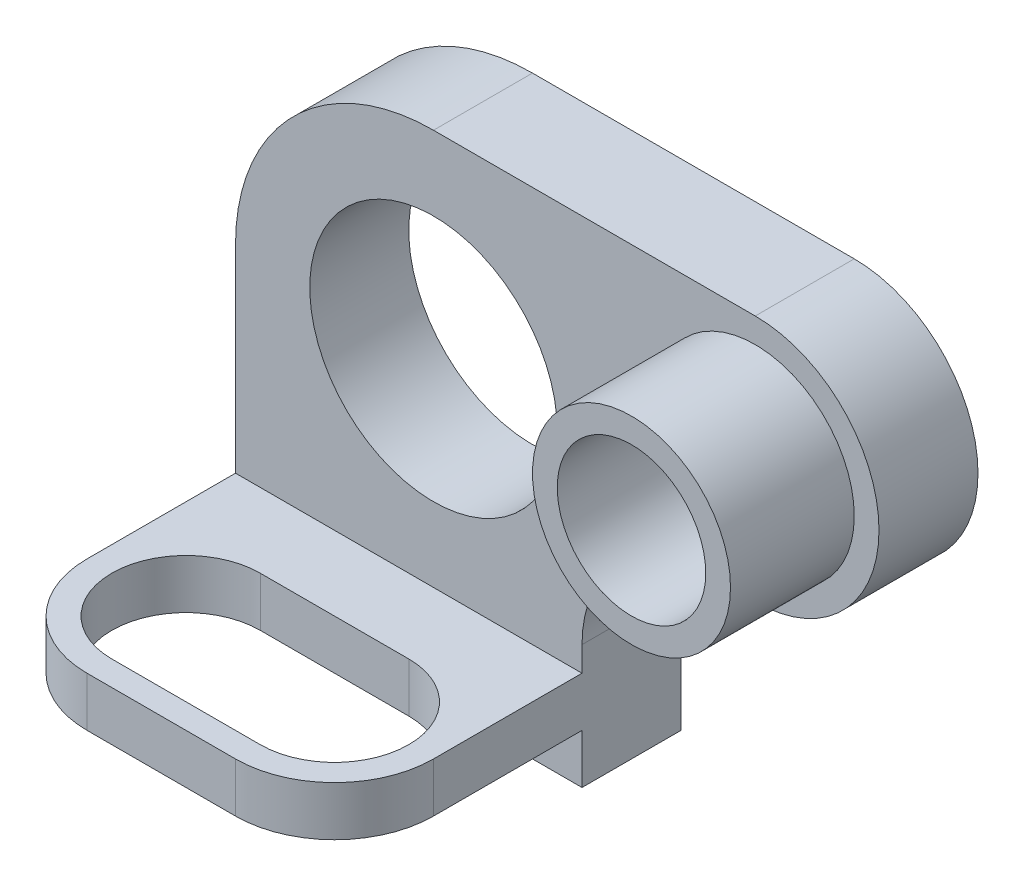
ISO-10303-21;
HEADER;
FILE_DESCRIPTION(('STEP AP214'),'2;1');
FILE_NAME('part.step','',(''),(''),'','','');
FILE_SCHEMA(('AUTOMOTIVE_DESIGN { 1 0 10303 214 1 1 1 1 }'));
ENDSEC;
DATA;
#1=APPLICATION_CONTEXT('core data for automotive mechanical design processes');
#2=APPLICATION_PROTOCOL_DEFINITION('international standard','automotive_design',2000,#1);
#3=PRODUCT_CONTEXT('',#1,'mechanical');
#4=PRODUCT('Part','Part','',(#3));
#5=PRODUCT_RELATED_PRODUCT_CATEGORY('part','',(#4));
#6=PRODUCT_DEFINITION_FORMATION('','',#4);
#7=PRODUCT_DEFINITION_CONTEXT('part definition',#1,'design');
#8=PRODUCT_DEFINITION('design','',#6,#7);
#9=PRODUCT_DEFINITION_SHAPE('','',#8);
#10=(LENGTH_UNIT() NAMED_UNIT(*) SI_UNIT(.MILLI.,.METRE.));
#11=(NAMED_UNIT(*) PLANE_ANGLE_UNIT() SI_UNIT($,.RADIAN.));
#12=(NAMED_UNIT(*) SI_UNIT($,.STERADIAN.) SOLID_ANGLE_UNIT());
#13=UNCERTAINTY_MEASURE_WITH_UNIT(LENGTH_MEASURE(1.E-05),#10,'distance_accuracy_value','');
#14=(GEOMETRIC_REPRESENTATION_CONTEXT(3) GLOBAL_UNCERTAINTY_ASSIGNED_CONTEXT((#13)) GLOBAL_UNIT_ASSIGNED_CONTEXT((#10,
#11,#12)) REPRESENTATION_CONTEXT('',''));
#15=CARTESIAN_POINT('',(0.,0.,0.));
#16=DIRECTION('',(0.,0.,1.));
#17=DIRECTION('',(1.,0.,0.));
#18=AXIS2_PLACEMENT_3D('',#15,#16,#17);
#19=CARTESIAN_POINT('',(0.,9.99999999999999,-90.7106781186548));
#20=DIRECTION('',(0.,1.,0.));
#21=DIRECTION('',(-1.,0.,0.));
#22=AXIS2_PLACEMENT_3D('',#19,#20,#21);
#23=PLANE('',#22);
#24=DIRECTION('',(-1.,0.,0.));
#25=VECTOR('',#24,1.);
#26=CARTESIAN_POINT('',(0.,9.99999999999999,15.));
#27=LINE('',#26,#25);
#28=CARTESIAN_POINT('',(50.,10.,15.));
#29=VERTEX_POINT('',#28);
#30=CARTESIAN_POINT('',(20.,9.99999999999999,15.));
#31=VERTEX_POINT('',#30);
#32=EDGE_CURVE('E195',#29,#31,#27,.T.);
#33=ORIENTED_EDGE('',*,*,#32,.T.);
#34=CARTESIAN_POINT('',(20.,9.99999999999999,30.));
#35=DIRECTION('',(0.,1.,0.));
#36=DIRECTION('',(-1.,0.,0.));
#37=AXIS2_PLACEMENT_3D('',#34,#35,#36);
#38=CIRCLE('',#37,15.);
#39=CARTESIAN_POINT('',(20.,9.99999999999999,45.));
#40=VERTEX_POINT('',#39);
#41=EDGE_CURVE('E198',#31,#40,#38,.T.);
#42=ORIENTED_EDGE('',*,*,#41,.T.);
#43=DIRECTION('',(1.,0.,0.));
#44=VECTOR('',#43,1.);
#45=CARTESIAN_POINT('',(0.,9.99999999999999,45.));
#46=LINE('',#45,#44);
#47=CARTESIAN_POINT('',(50.,10.,45.));
#48=VERTEX_POINT('',#47);
#49=EDGE_CURVE('E190',#40,#48,#46,.T.);
#50=ORIENTED_EDGE('',*,*,#49,.T.);
#51=CARTESIAN_POINT('',(50.,10.,30.));
#52=DIRECTION('',(0.,1.,0.));
#53=DIRECTION('',(-1.,0.,0.));
#54=AXIS2_PLACEMENT_3D('',#51,#52,#53);
#55=CIRCLE('',#54,15.);
#56=EDGE_CURVE('E170',#48,#29,#55,.T.);
#57=ORIENTED_EDGE('',*,*,#56,.T.);
#58=EDGE_LOOP('',(#33,#42,#50,#57));
#59=FACE_BOUND('',#58,.T.);
#60=DIRECTION('',(-1.,0.,0.));
#61=VECTOR('',#60,1.);
#62=CARTESIAN_POINT('',(0.,9.99999999999999,50.));
#63=LINE('',#62,#61);
#64=CARTESIAN_POINT('',(50.,10.,50.));
#65=VERTEX_POINT('',#64);
#66=CARTESIAN_POINT('',(20.,9.99999999999999,50.));
#67=VERTEX_POINT('',#66);
#68=EDGE_CURVE('E233',#65,#67,#63,.T.);
#69=ORIENTED_EDGE('',*,*,#68,.T.);
#70=CARTESIAN_POINT('',(20.,9.99999999999999,30.));
#71=DIRECTION('',(0.,1.,0.));
#72=DIRECTION('',(-1.,0.,0.));
#73=AXIS2_PLACEMENT_3D('',#70,#71,#72);
#74=CIRCLE('',#73,20.);
#75=CARTESIAN_POINT('',(0.,9.99999999999999,30.));
#76=VERTEX_POINT('',#75);
#77=EDGE_CURVE('E47',#67,#76,#74,.F.);
#78=ORIENTED_EDGE('',*,*,#77,.T.);
#79=DIRECTION('',(0.,0.,1.));
#80=VECTOR('',#79,1.);
#81=CARTESIAN_POINT('',(0.,9.99999999999999,-90.7106781186548));
#82=LINE('',#81,#80);
#83=CARTESIAN_POINT('',(0.,9.99999999999999,0.));
#84=VERTEX_POINT('',#83);
#85=EDGE_CURVE('E241',#84,#76,#82,.T.);
#86=ORIENTED_EDGE('',*,*,#85,.F.);
#87=DIRECTION('',(-1.,0.,0.));
#88=VECTOR('',#87,1.);
#89=CARTESIAN_POINT('',(0.,9.99999999999999,0.));
#90=LINE('',#89,#88);
#91=CARTESIAN_POINT('',(70.,9.99999999999999,0.));
#92=VERTEX_POINT('',#91);
#93=EDGE_CURVE('E218',#92,#84,#90,.T.);
#94=ORIENTED_EDGE('',*,*,#93,.F.);
#95=DIRECTION('',(0.,0.,1.));
#96=VECTOR('',#95,1.);
#97=CARTESIAN_POINT('',(70.,9.99999999999999,-90.7106781186548));
#98=LINE('',#97,#96);
#99=CARTESIAN_POINT('',(70.,9.99999999999999,30.));
#100=VERTEX_POINT('',#99);
#101=EDGE_CURVE('E237',#92,#100,#98,.T.);
#102=ORIENTED_EDGE('',*,*,#101,.T.);
#103=CARTESIAN_POINT('',(50.,10.,30.));
#104=DIRECTION('',(0.,1.,0.));
#105=DIRECTION('',(-1.,0.,0.));
#106=AXIS2_PLACEMENT_3D('',#103,#104,#105);
#107=CIRCLE('',#106,20.);
#108=EDGE_CURVE('E319',#100,#65,#107,.F.);
#109=ORIENTED_EDGE('',*,*,#108,.T.);
#110=EDGE_LOOP('',(#69,#78,#86,#94,#102,#109));
#111=FACE_BOUND('',#110,.T.);
#112=ADVANCED_FACE('F39',(#59,#111),#23,.F.);
#113=CARTESIAN_POINT('',(40.,60.,-20.));
#114=DIRECTION('',(0.,0.,1.));
#115=DIRECTION('',(1.,0.,0.));
#116=AXIS2_PLACEMENT_3D('',#113,#114,#115);
#117=CYLINDRICAL_SURFACE('',#116,40.);
#118=CARTESIAN_POINT('',(40.,60.,0.));
#119=DIRECTION('',(0.,0.,1.));
#120=DIRECTION('',(1.,0.,0.));
#121=AXIS2_PLACEMENT_3D('',#118,#119,#120);
#122=CIRCLE('',#121,40.);
#123=CARTESIAN_POINT('',(0.,59.9999999999997,0.));
#124=VERTEX_POINT('',#123);
#125=CARTESIAN_POINT('',(40.0000000000003,100.,0.));
#126=VERTEX_POINT('',#125);
#127=EDGE_CURVE('E271',#124,#126,#122,.F.);
#128=ORIENTED_EDGE('',*,*,#127,.T.);
#129=DIRECTION('',(0.,0.,1.));
#130=VECTOR('',#129,1.);
#131=CARTESIAN_POINT('',(40.0000000000003,100.,-20.));
#132=LINE('',#131,#130);
#133=CARTESIAN_POINT('',(40.0000000000003,100.,-20.));
#134=VERTEX_POINT('',#133);
#135=EDGE_CURVE('E291',#134,#126,#132,.T.);
#136=ORIENTED_EDGE('',*,*,#135,.F.);
#137=CARTESIAN_POINT('',(40.,60.,-20.));
#138=DIRECTION('',(0.,0.,1.));
#139=DIRECTION('',(1.,0.,0.));
#140=AXIS2_PLACEMENT_3D('',#137,#138,#139);
#141=CIRCLE('',#140,40.);
#142=CARTESIAN_POINT('',(0.,59.9999999999997,-20.));
#143=VERTEX_POINT('',#142);
#144=EDGE_CURVE('E249',#143,#134,#141,.F.);
#145=ORIENTED_EDGE('',*,*,#144,.F.);
#146=DIRECTION('',(0.,0.,1.));
#147=VECTOR('',#146,1.);
#148=CARTESIAN_POINT('',(0.,59.9999999999997,-20.));
#149=LINE('',#148,#147);
#150=EDGE_CURVE('E268',#143,#124,#149,.T.);
#151=ORIENTED_EDGE('',*,*,#150,.T.);
#152=EDGE_LOOP('',(#128,#136,#145,#151));
#153=FACE_BOUND('',#152,.T.);
#154=ADVANCED_FACE('F354',(#153),#117,.T.);
#155=CARTESIAN_POINT('',(0.,100.,-20.));
#156=DIRECTION('',(0.,-1.,0.));
#157=DIRECTION('',(0.,0.,-1.));
#158=AXIS2_PLACEMENT_3D('',#155,#156,#157);
#159=PLANE('',#158);
#160=DIRECTION('',(1.,0.,0.));
#161=VECTOR('',#160,1.);
#162=CARTESIAN_POINT('',(0.,100.,0.));
#163=LINE('',#162,#161);
#164=CARTESIAN_POINT('',(105.,100.,0.));
#165=VERTEX_POINT('',#164);
#166=EDGE_CURVE('E287',#126,#165,#163,.T.);
#167=ORIENTED_EDGE('',*,*,#166,.T.);
#168=DIRECTION('',(0.,0.,1.));
#169=VECTOR('',#168,1.);
#170=CARTESIAN_POINT('',(105.,100.,-20.));
#171=LINE('',#170,#169);
#172=CARTESIAN_POINT('',(105.,100.,-20.));
#173=VERTEX_POINT('',#172);
#174=EDGE_CURVE('E295',#173,#165,#171,.T.);
#175=ORIENTED_EDGE('',*,*,#174,.F.);
#176=DIRECTION('',(1.,0.,0.));
#177=VECTOR('',#176,1.);
#178=CARTESIAN_POINT('',(0.,100.,-20.));
#179=LINE('',#178,#177);
#180=EDGE_CURVE('E263',#134,#173,#179,.T.);
#181=ORIENTED_EDGE('',*,*,#180,.F.);
#182=ORIENTED_EDGE('',*,*,#135,.T.);
#183=EDGE_LOOP('',(#167,#175,#181,#182));
#184=FACE_BOUND('',#183,.T.);
#185=ADVANCED_FACE('F360',(#184),#159,.F.);
#186=CARTESIAN_POINT('',(105.,75.,-20.));
#187=DIRECTION('',(0.,0.,1.));
#188=DIRECTION('',(1.,0.,0.));
#189=AXIS2_PLACEMENT_3D('',#186,#187,#188);
#190=CYLINDRICAL_SURFACE('',#189,25.);
#191=CARTESIAN_POINT('',(105.,75.,0.));
#192=DIRECTION('',(0.,0.,1.));
#193=DIRECTION('',(1.,0.,0.));
#194=AXIS2_PLACEMENT_3D('',#191,#192,#193);
#195=CIRCLE('',#194,25.);
#196=CARTESIAN_POINT('',(105.,50.,0.));
#197=VERTEX_POINT('',#196);
#198=EDGE_CURVE('E285',#165,#197,#195,.F.);
#199=ORIENTED_EDGE('',*,*,#198,.T.);
#200=DIRECTION('',(0.,0.,1.));
#201=VECTOR('',#200,1.);
#202=CARTESIAN_POINT('',(105.,50.,-20.));
#203=LINE('',#202,#201);
#204=CARTESIAN_POINT('',(105.,50.,-20.));
#205=VERTEX_POINT('',#204);
#206=EDGE_CURVE('E298',#205,#197,#203,.T.);
#207=ORIENTED_EDGE('',*,*,#206,.F.);
#208=CARTESIAN_POINT('',(105.,75.,-20.));
#209=DIRECTION('',(0.,0.,1.));
#210=DIRECTION('',(1.,0.,0.));
#211=AXIS2_PLACEMENT_3D('',#208,#209,#210);
#212=CIRCLE('',#211,25.);
#213=EDGE_CURVE('E261',#173,#205,#212,.F.);
#214=ORIENTED_EDGE('',*,*,#213,.F.);
#215=ORIENTED_EDGE('',*,*,#174,.T.);
#216=EDGE_LOOP('',(#199,#207,#214,#215));
#217=FACE_BOUND('',#216,.T.);
#218=ADVANCED_FACE('F403',(#217),#190,.T.);
#219=CARTESIAN_POINT('',(0.,50.0000000000001,-20.));
#220=DIRECTION('',(0.,1.,0.));
#221=DIRECTION('',(-1.,0.,0.));
#222=AXIS2_PLACEMENT_3D('',#219,#220,#221);
#223=PLANE('',#222);
#224=DIRECTION('',(-1.,0.,0.));
#225=VECTOR('',#224,1.);
#226=CARTESIAN_POINT('',(0.,50.0000000000001,0.));
#227=LINE('',#226,#225);
#228=CARTESIAN_POINT('',(95.0000000000002,50.,0.));
#229=VERTEX_POINT('',#228);
#230=EDGE_CURVE('E283',#197,#229,#227,.T.);
#231=ORIENTED_EDGE('',*,*,#230,.T.);
#232=DIRECTION('',(0.,0.,1.));
#233=VECTOR('',#232,1.);
#234=CARTESIAN_POINT('',(95.0000000000002,50.,-20.));
#235=LINE('',#234,#233);
#236=CARTESIAN_POINT('',(95.0000000000002,50.,-20.));
#237=VERTEX_POINT('',#236);
#238=EDGE_CURVE('E301',#237,#229,#235,.T.);
#239=ORIENTED_EDGE('',*,*,#238,.F.);
#240=DIRECTION('',(-1.,0.,0.));
#241=VECTOR('',#240,1.);
#242=CARTESIAN_POINT('',(0.,50.0000000000001,-20.));
#243=LINE('',#242,#241);
#244=EDGE_CURVE('E259',#205,#237,#243,.T.);
#245=ORIENTED_EDGE('',*,*,#244,.F.);
#246=ORIENTED_EDGE('',*,*,#206,.T.);
#247=EDGE_LOOP('',(#231,#239,#245,#246));
#248=FACE_BOUND('',#247,.T.);
#249=ADVANCED_FACE('F406',(#248),#223,.F.);
#250=CARTESIAN_POINT('',(95.,25.,-20.));
#251=DIRECTION('',(0.,0.,1.));
#252=DIRECTION('',(1.,0.,0.));
#253=AXIS2_PLACEMENT_3D('',#250,#251,#252);
#254=CYLINDRICAL_SURFACE('',#253,25.);
#255=CARTESIAN_POINT('',(95.,25.,0.));
#256=DIRECTION('',(0.,0.,1.));
#257=DIRECTION('',(1.,0.,0.));
#258=AXIS2_PLACEMENT_3D('',#255,#256,#257);
#259=CIRCLE('',#258,25.);
#260=CARTESIAN_POINT('',(70.,24.9999999999998,0.));
#261=VERTEX_POINT('',#260);
#262=EDGE_CURVE('E281',#229,#261,#259,.T.);
#263=ORIENTED_EDGE('',*,*,#262,.T.);
#264=DIRECTION('',(0.,0.,1.));
#265=VECTOR('',#264,1.);
#266=CARTESIAN_POINT('',(70.,24.9999999999998,-20.));
#267=LINE('',#266,#265);
#268=CARTESIAN_POINT('',(70.,24.9999999999998,-20.));
#269=VERTEX_POINT('',#268);
#270=EDGE_CURVE('E304',#269,#261,#267,.T.);
#271=ORIENTED_EDGE('',*,*,#270,.F.);
#272=CARTESIAN_POINT('',(95.,25.,-20.));
#273=DIRECTION('',(0.,0.,1.));
#274=DIRECTION('',(1.,0.,0.));
#275=AXIS2_PLACEMENT_3D('',#272,#273,#274);
#276=CIRCLE('',#275,25.);
#277=EDGE_CURVE('E257',#237,#269,#276,.T.);
#278=ORIENTED_EDGE('',*,*,#277,.F.);
#279=ORIENTED_EDGE('',*,*,#238,.T.);
#280=EDGE_LOOP('',(#263,#271,#278,#279));
#281=FACE_BOUND('',#280,.T.);
#282=ADVANCED_FACE('F410',(#281),#254,.F.);
#283=CARTESIAN_POINT('',(70.,0.,-20.));
#284=DIRECTION('',(-1.,0.,0.));
#285=DIRECTION('',(0.,0.,1.));
#286=AXIS2_PLACEMENT_3D('',#283,#284,#285);
#287=PLANE('',#286);
#288=DIRECTION('',(0.,0.,1.));
#289=VECTOR('',#288,1.);
#290=CARTESIAN_POINT('',(70.,20.,-90.7106781186548));
#291=LINE('',#290,#289);
#292=CARTESIAN_POINT('',(70.,20.,0.));
#293=VERTEX_POINT('',#292);
#294=CARTESIAN_POINT('',(70.,20.,30.));
#295=VERTEX_POINT('',#294);
#296=EDGE_CURVE('E236',#293,#295,#291,.T.);
#297=ORIENTED_EDGE('',*,*,#296,.T.);
#298=DIRECTION('',(0.,-1.,0.));
#299=VECTOR('',#298,1.);
#300=CARTESIAN_POINT('',(70.,9.99999999999999,30.));
#301=LINE('',#300,#299);
#302=EDGE_CURVE('E11',#295,#100,#301,.T.);
#303=ORIENTED_EDGE('',*,*,#302,.T.);
#304=ORIENTED_EDGE('',*,*,#101,.F.);
#305=DIRECTION('',(0.,-1.,0.));
#306=VECTOR('',#305,1.);
#307=CARTESIAN_POINT('',(70.,0.,0.));
#308=LINE('',#307,#306);
#309=CARTESIAN_POINT('',(70.,0.,0.));
#310=VERTEX_POINT('',#309);
#311=EDGE_CURVE('E210',#92,#310,#308,.T.);
#312=ORIENTED_EDGE('',*,*,#311,.T.);
#313=DIRECTION('',(0.,0.,1.));
#314=VECTOR('',#313,1.);
#315=CARTESIAN_POINT('',(70.,0.,-20.));
#316=LINE('',#315,#314);
#317=CARTESIAN_POINT('',(70.,0.,-20.));
#318=VERTEX_POINT('',#317);
#319=EDGE_CURVE('E225',#318,#310,#316,.T.);
#320=ORIENTED_EDGE('',*,*,#319,.F.);
#321=DIRECTION('',(0.,-1.,0.));
#322=VECTOR('',#321,1.);
#323=CARTESIAN_POINT('',(70.,0.,-20.));
#324=LINE('',#323,#322);
#325=EDGE_CURVE('E255',#269,#318,#324,.T.);
#326=ORIENTED_EDGE('',*,*,#325,.F.);
#327=ORIENTED_EDGE('',*,*,#270,.T.);
#328=DIRECTION('',(0.,-1.,0.));
#329=VECTOR('',#328,1.);
#330=CARTESIAN_POINT('',(70.,0.,0.));
#331=LINE('',#330,#329);
#332=EDGE_CURVE('E279',#261,#293,#331,.T.);
#333=ORIENTED_EDGE('',*,*,#332,.T.);
#334=EDGE_LOOP('',(#297,#303,#304,#312,#320,#326,#327,#333));
#335=FACE_BOUND('',#334,.T.);
#336=ADVANCED_FACE('F340',(#335),#287,.F.);
#337=CARTESIAN_POINT('',(0.,0.,-20.));
#338=DIRECTION('',(1.,0.,0.));
#339=DIRECTION('',(0.,0.,-1.));
#340=AXIS2_PLACEMENT_3D('',#337,#338,#339);
#341=PLANE('',#340);
#342=ORIENTED_EDGE('',*,*,#85,.T.);
#343=DIRECTION('',(0.,1.,0.));
#344=VECTOR('',#343,1.);
#345=CARTESIAN_POINT('',(0.,20.,30.));
#346=LINE('',#345,#344);
#347=CARTESIAN_POINT('',(0.,20.,30.));
#348=VERTEX_POINT('',#347);
#349=EDGE_CURVE('E294',#76,#348,#346,.T.);
#350=ORIENTED_EDGE('',*,*,#349,.T.);
#351=DIRECTION('',(0.,0.,1.));
#352=VECTOR('',#351,1.);
#353=CARTESIAN_POINT('',(0.,20.,-90.7106781186548));
#354=LINE('',#353,#352);
#355=CARTESIAN_POINT('',(0.,20.,0.));
#356=VERTEX_POINT('',#355);
#357=EDGE_CURVE('E244',#356,#348,#354,.T.);
#358=ORIENTED_EDGE('',*,*,#357,.F.);
#359=DIRECTION('',(0.,1.,0.));
#360=VECTOR('',#359,1.);
#361=CARTESIAN_POINT('',(0.,0.,0.));
#362=LINE('',#361,#360);
#363=EDGE_CURVE('E274',#356,#124,#362,.T.);
#364=ORIENTED_EDGE('',*,*,#363,.T.);
#365=ORIENTED_EDGE('',*,*,#150,.F.);
#366=DIRECTION('',(0.,1.,0.));
#367=VECTOR('',#366,1.);
#368=CARTESIAN_POINT('',(0.,0.,-20.));
#369=LINE('',#368,#367);
#370=CARTESIAN_POINT('',(0.,0.,-20.));
#371=VERTEX_POINT('',#370);
#372=EDGE_CURVE('E252',#371,#143,#369,.T.);
#373=ORIENTED_EDGE('',*,*,#372,.F.);
#374=DIRECTION('',(0.,0.,1.));
#375=VECTOR('',#374,1.);
#376=CARTESIAN_POINT('',(0.,0.,-20.));
#377=LINE('',#376,#375);
#378=CARTESIAN_POINT('',(0.,0.,0.));
#379=VERTEX_POINT('',#378);
#380=EDGE_CURVE('E214',#371,#379,#377,.T.);
#381=ORIENTED_EDGE('',*,*,#380,.T.);
#382=DIRECTION('',(0.,1.,0.));
#383=VECTOR('',#382,1.);
#384=CARTESIAN_POINT('',(0.,0.,0.));
#385=LINE('',#384,#383);
#386=EDGE_CURVE('E221',#379,#84,#385,.T.);
#387=ORIENTED_EDGE('',*,*,#386,.T.);
#388=EDGE_LOOP('',(#342,#350,#358,#364,#365,#373,#381,#387));
#389=FACE_BOUND('',#388,.T.);
#390=ADVANCED_FACE('F327',(#389),#341,.F.);
#391=CARTESIAN_POINT('',(40.,60.,-20.));
#392=DIRECTION('',(0.,0.,1.));
#393=DIRECTION('',(1.,0.,0.));
#394=AXIS2_PLACEMENT_3D('',#391,#392,#393);
#395=CYLINDRICAL_SURFACE('',#394,25.);
#396=CARTESIAN_POINT('',(40.,60.,-20.));
#397=DIRECTION('',(0.,0.,1.));
#398=DIRECTION('',(1.,0.,0.));
#399=AXIS2_PLACEMENT_3D('',#396,#397,#398);
#400=CIRCLE('',#399,25.);
#401=CARTESIAN_POINT('',(65.,60.,-20.));
#402=VERTEX_POINT('',#401);
#403=EDGE_CURVE('E265',#402,#402,#400,.T.);
#404=ORIENTED_EDGE('',*,*,#403,.F.);
#405=EDGE_LOOP('',(#404));
#406=FACE_BOUND('',#405,.T.);
#407=CARTESIAN_POINT('',(40.,60.,0.));
#408=DIRECTION('',(0.,0.,1.));
#409=DIRECTION('',(1.,0.,0.));
#410=AXIS2_PLACEMENT_3D('',#407,#408,#409);
#411=CIRCLE('',#410,25.);
#412=CARTESIAN_POINT('',(65.,60.,0.));
#413=VERTEX_POINT('',#412);
#414=EDGE_CURVE('E253',#413,#413,#411,.T.);
#415=ORIENTED_EDGE('',*,*,#414,.T.);
#416=EDGE_LOOP('',(#415));
#417=FACE_BOUND('',#416,.T.);
#418=ADVANCED_FACE('F394',(#406,#417),#395,.F.);
#419=CARTESIAN_POINT('',(0.,0.,-20.));
#420=DIRECTION('',(0.,0.,1.));
#421=DIRECTION('',(1.,0.,0.));
#422=AXIS2_PLACEMENT_3D('',#419,#420,#421);
#423=PLANE('',#422);
#424=ORIENTED_EDGE('',*,*,#144,.T.);
#425=ORIENTED_EDGE('',*,*,#180,.T.);
#426=ORIENTED_EDGE('',*,*,#213,.T.);
#427=ORIENTED_EDGE('',*,*,#244,.T.);
#428=ORIENTED_EDGE('',*,*,#277,.T.);
#429=ORIENTED_EDGE('',*,*,#325,.T.);
#430=DIRECTION('',(-1.,0.,0.));
#431=VECTOR('',#430,1.);
#432=CARTESIAN_POINT('',(0.,0.,-20.));
#433=LINE('',#432,#431);
#434=EDGE_CURVE('E211',#318,#371,#433,.T.);
#435=ORIENTED_EDGE('',*,*,#434,.T.);
#436=ORIENTED_EDGE('',*,*,#372,.T.);
#437=EDGE_LOOP('',(#424,#425,#426,#427,#428,#429,#435,#436));
#438=FACE_BOUND('',#437,.T.);
#439=ORIENTED_EDGE('',*,*,#403,.T.);
#440=EDGE_LOOP('',(#439));
#441=FACE_BOUND('',#440,.T.);
#442=CARTESIAN_POINT('',(105.,75.,-20.));
#443=DIRECTION('',(0.,0.,1.));
#444=DIRECTION('',(1.,0.,0.));
#445=AXIS2_PLACEMENT_3D('',#442,#443,#444);
#446=CIRCLE('',#445,15.);
#447=CARTESIAN_POINT('',(120.,75.,-20.));
#448=VERTEX_POINT('',#447);
#449=EDGE_CURVE('E207',#448,#448,#446,.F.);
#450=ORIENTED_EDGE('',*,*,#449,.F.);
#451=EDGE_LOOP('',(#450));
#452=FACE_BOUND('',#451,.T.);
#453=ADVANCED_FACE('F363',(#438,#441,#452),#423,.F.);
#454=CARTESIAN_POINT('',(0.,0.,0.));
#455=DIRECTION('',(0.,0.,1.));
#456=DIRECTION('',(1.,0.,0.));
#457=AXIS2_PLACEMENT_3D('',#454,#455,#456);
#458=PLANE('',#457);
#459=CARTESIAN_POINT('',(105.,75.,0.));
#460=DIRECTION('',(0.,0.,1.));
#461=DIRECTION('',(1.,0.,0.));
#462=AXIS2_PLACEMENT_3D('',#459,#460,#461);
#463=CIRCLE('',#462,20.);
#464=CARTESIAN_POINT('',(125.,75.,0.));
#465=VERTEX_POINT('',#464);
#466=EDGE_CURVE('E240',#465,#465,#463,.T.);
#467=ORIENTED_EDGE('',*,*,#466,.F.);
#468=EDGE_LOOP('',(#467));
#469=FACE_BOUND('',#468,.T.);
#470=ORIENTED_EDGE('',*,*,#127,.F.);
#471=ORIENTED_EDGE('',*,*,#363,.F.);
#472=DIRECTION('',(-1.,0.,0.));
#473=VECTOR('',#472,1.);
#474=CARTESIAN_POINT('',(0.,20.,0.));
#475=LINE('',#474,#473);
#476=EDGE_CURVE('E276',#293,#356,#475,.T.);
#477=ORIENTED_EDGE('',*,*,#476,.F.);
#478=ORIENTED_EDGE('',*,*,#332,.F.);
#479=ORIENTED_EDGE('',*,*,#262,.F.);
#480=ORIENTED_EDGE('',*,*,#230,.F.);
#481=ORIENTED_EDGE('',*,*,#198,.F.);
#482=ORIENTED_EDGE('',*,*,#166,.F.);
#483=EDGE_LOOP('',(#470,#471,#477,#478,#479,#480,#481,#482));
#484=FACE_BOUND('',#483,.T.);
#485=ORIENTED_EDGE('',*,*,#414,.F.);
#486=EDGE_LOOP('',(#485));
#487=FACE_BOUND('',#486,.T.);
#488=ADVANCED_FACE('F349',(#469,#484,#487),#458,.T.);
#489=CARTESIAN_POINT('',(0.,20.,-90.7106781186548));
#490=DIRECTION('',(0.,1.,0.));
#491=DIRECTION('',(-1.,0.,0.));
#492=AXIS2_PLACEMENT_3D('',#489,#490,#491);
#493=PLANE('',#492);
#494=CARTESIAN_POINT('',(20.,20.,30.));
#495=DIRECTION('',(0.,1.,0.));
#496=DIRECTION('',(-1.,0.,0.));
#497=AXIS2_PLACEMENT_3D('',#494,#495,#496);
#498=CIRCLE('',#497,15.);
#499=CARTESIAN_POINT('',(20.,20.,15.));
#500=VERTEX_POINT('',#499);
#501=CARTESIAN_POINT('',(20.,20.,45.));
#502=VERTEX_POINT('',#501);
#503=EDGE_CURVE('E62',#500,#502,#498,.T.);
#504=ORIENTED_EDGE('',*,*,#503,.F.);
#505=DIRECTION('',(-1.,0.,0.));
#506=VECTOR('',#505,1.);
#507=CARTESIAN_POINT('',(20.,20.,15.));
#508=LINE('',#507,#506);
#509=CARTESIAN_POINT('',(50.,20.,15.));
#510=VERTEX_POINT('',#509);
#511=EDGE_CURVE('E183',#510,#500,#508,.T.);
#512=ORIENTED_EDGE('',*,*,#511,.F.);
#513=CARTESIAN_POINT('',(50.,20.,30.));
#514=DIRECTION('',(0.,1.,0.));
#515=DIRECTION('',(-1.,0.,0.));
#516=AXIS2_PLACEMENT_3D('',#513,#514,#515);
#517=CIRCLE('',#516,15.);
#518=CARTESIAN_POINT('',(50.,20.,45.));
#519=VERTEX_POINT('',#518);
#520=EDGE_CURVE('E167',#519,#510,#517,.T.);
#521=ORIENTED_EDGE('',*,*,#520,.F.);
#522=DIRECTION('',(1.,0.,0.));
#523=VECTOR('',#522,1.);
#524=CARTESIAN_POINT('',(20.,20.,45.));
#525=LINE('',#524,#523);
#526=EDGE_CURVE('E176',#502,#519,#525,.T.);
#527=ORIENTED_EDGE('',*,*,#526,.F.);
#528=EDGE_LOOP('',(#504,#512,#521,#527));
#529=FACE_BOUND('',#528,.T.);
#530=ORIENTED_EDGE('',*,*,#357,.T.);
#531=CARTESIAN_POINT('',(20.,20.,30.));
#532=DIRECTION('',(0.,1.,0.));
#533=DIRECTION('',(-1.,0.,0.));
#534=AXIS2_PLACEMENT_3D('',#531,#532,#533);
#535=CIRCLE('',#534,20.);
#536=CARTESIAN_POINT('',(20.,20.,50.));
#537=VERTEX_POINT('',#536);
#538=EDGE_CURVE('E313',#348,#537,#535,.T.);
#539=ORIENTED_EDGE('',*,*,#538,.T.);
#540=DIRECTION('',(-1.,0.,0.));
#541=VECTOR('',#540,1.);
#542=CARTESIAN_POINT('',(0.,20.,50.));
#543=LINE('',#542,#541);
#544=CARTESIAN_POINT('',(50.,20.,50.));
#545=VERTEX_POINT('',#544);
#546=EDGE_CURVE('E228',#545,#537,#543,.T.);
#547=ORIENTED_EDGE('',*,*,#546,.F.);
#548=CARTESIAN_POINT('',(50.,20.,30.));
#549=DIRECTION('',(0.,1.,0.));
#550=DIRECTION('',(-1.,0.,0.));
#551=AXIS2_PLACEMENT_3D('',#548,#549,#550);
#552=CIRCLE('',#551,20.);
#553=EDGE_CURVE('E311',#545,#295,#552,.T.);
#554=ORIENTED_EDGE('',*,*,#553,.T.);
#555=ORIENTED_EDGE('',*,*,#296,.F.);
#556=ORIENTED_EDGE('',*,*,#476,.T.);
#557=EDGE_LOOP('',(#530,#539,#547,#554,#555,#556));
#558=FACE_BOUND('',#557,.T.);
#559=ADVANCED_FACE('F180',(#529,#558),#493,.T.);
#560=CARTESIAN_POINT('',(0.,0.,50.));
#561=DIRECTION('',(0.,0.,1.));
#562=DIRECTION('',(1.,0.,0.));
#563=AXIS2_PLACEMENT_3D('',#560,#561,#562);
#564=PLANE('',#563);
#565=ORIENTED_EDGE('',*,*,#546,.T.);
#566=DIRECTION('',(0.,1.,0.));
#567=VECTOR('',#566,1.);
#568=CARTESIAN_POINT('',(20.,9.99999999999999,50.));
#569=LINE('',#568,#567);
#570=EDGE_CURVE('E317',#537,#67,#569,.F.);
#571=ORIENTED_EDGE('',*,*,#570,.T.);
#572=ORIENTED_EDGE('',*,*,#68,.F.);
#573=DIRECTION('',(0.,-1.,0.));
#574=VECTOR('',#573,1.);
#575=CARTESIAN_POINT('',(50.,20.,50.));
#576=LINE('',#575,#574);
#577=EDGE_CURVE('E315',#65,#545,#576,.F.);
#578=ORIENTED_EDGE('',*,*,#577,.T.);
#579=EDGE_LOOP('',(#565,#571,#572,#578));
#580=FACE_BOUND('',#579,.T.);
#581=ADVANCED_FACE('F334',(#580),#564,.T.);
#582=CARTESIAN_POINT('',(0.,0.,-20.));
#583=DIRECTION('',(0.,1.,0.));
#584=DIRECTION('',(0.,0.,1.));
#585=AXIS2_PLACEMENT_3D('',#582,#583,#584);
#586=PLANE('',#585);
#587=DIRECTION('',(-1.,0.,0.));
#588=VECTOR('',#587,1.);
#589=CARTESIAN_POINT('',(0.,0.,0.));
#590=LINE('',#589,#588);
#591=EDGE_CURVE('E215',#310,#379,#590,.T.);
#592=ORIENTED_EDGE('',*,*,#591,.T.);
#593=ORIENTED_EDGE('',*,*,#380,.F.);
#594=ORIENTED_EDGE('',*,*,#434,.F.);
#595=ORIENTED_EDGE('',*,*,#319,.T.);
#596=EDGE_LOOP('',(#592,#593,#594,#595));
#597=FACE_BOUND('',#596,.T.);
#598=ADVANCED_FACE('F372',(#597),#586,.F.);
#599=CARTESIAN_POINT('',(0.,0.,0.));
#600=DIRECTION('',(0.,0.,1.));
#601=DIRECTION('',(1.,0.,0.));
#602=AXIS2_PLACEMENT_3D('',#599,#600,#601);
#603=PLANE('',#602);
#604=ORIENTED_EDGE('',*,*,#311,.F.);
#605=ORIENTED_EDGE('',*,*,#93,.T.);
#606=ORIENTED_EDGE('',*,*,#386,.F.);
#607=ORIENTED_EDGE('',*,*,#591,.F.);
#608=EDGE_LOOP('',(#604,#605,#606,#607));
#609=FACE_BOUND('',#608,.T.);
#610=ADVANCED_FACE('F370',(#609),#603,.T.);
#611=CARTESIAN_POINT('',(105.,75.,-76.5685424949238));
#612=DIRECTION('',(0.,0.,1.));
#613=DIRECTION('',(1.,0.,0.));
#614=AXIS2_PLACEMENT_3D('',#611,#612,#613);
#615=CYLINDRICAL_SURFACE('',#614,15.);
#616=ORIENTED_EDGE('',*,*,#449,.T.);
#617=EDGE_LOOP('',(#616));
#618=FACE_BOUND('',#617,.T.);
#619=CARTESIAN_POINT('',(105.,75.,25.));
#620=DIRECTION('',(0.,0.,1.));
#621=DIRECTION('',(1.,0.,0.));
#622=AXIS2_PLACEMENT_3D('',#619,#620,#621);
#623=CIRCLE('',#622,15.);
#624=CARTESIAN_POINT('',(120.,75.,25.));
#625=VERTEX_POINT('',#624);
#626=EDGE_CURVE('E201',#625,#625,#623,.T.);
#627=ORIENTED_EDGE('',*,*,#626,.T.);
#628=EDGE_LOOP('',(#627));
#629=FACE_BOUND('',#628,.T.);
#630=ADVANCED_FACE('F379',(#618,#629),#615,.F.);
#631=CARTESIAN_POINT('',(105.,75.,-76.5685424949238));
#632=DIRECTION('',(0.,0.,1.));
#633=DIRECTION('',(1.,0.,0.));
#634=AXIS2_PLACEMENT_3D('',#631,#632,#633);
#635=CYLINDRICAL_SURFACE('',#634,20.);
#636=ORIENTED_EDGE('',*,*,#466,.T.);
#637=EDGE_LOOP('',(#636));
#638=FACE_BOUND('',#637,.T.);
#639=CARTESIAN_POINT('',(105.,75.,25.));
#640=DIRECTION('',(0.,0.,1.));
#641=DIRECTION('',(1.,0.,0.));
#642=AXIS2_PLACEMENT_3D('',#639,#640,#641);
#643=CIRCLE('',#642,20.);
#644=CARTESIAN_POINT('',(125.,75.,25.));
#645=VERTEX_POINT('',#644);
#646=EDGE_CURVE('E204',#645,#645,#643,.T.);
#647=ORIENTED_EDGE('',*,*,#646,.F.);
#648=EDGE_LOOP('',(#647));
#649=FACE_BOUND('',#648,.T.);
#650=ADVANCED_FACE('F425',(#638,#649),#635,.T.);
#651=CARTESIAN_POINT('',(0.,0.,25.));
#652=DIRECTION('',(0.,0.,1.));
#653=DIRECTION('',(1.,0.,0.));
#654=AXIS2_PLACEMENT_3D('',#651,#652,#653);
#655=PLANE('',#654);
#656=ORIENTED_EDGE('',*,*,#626,.F.);
#657=EDGE_LOOP('',(#656));
#658=FACE_BOUND('',#657,.T.);
#659=ORIENTED_EDGE('',*,*,#646,.T.);
#660=EDGE_LOOP('',(#659));
#661=FACE_BOUND('',#660,.T.);
#662=ADVANCED_FACE('F419',(#658,#661),#655,.T.);
#663=CARTESIAN_POINT('',(20.,0.,30.));
#664=DIRECTION('',(0.,-1.,0.));
#665=DIRECTION('',(0.,0.,-1.));
#666=AXIS2_PLACEMENT_3D('',#663,#664,#665);
#667=CYLINDRICAL_SURFACE('',#666,20.);
#668=ORIENTED_EDGE('',*,*,#77,.F.);
#669=ORIENTED_EDGE('',*,*,#570,.F.);
#670=ORIENTED_EDGE('',*,*,#538,.F.);
#671=ORIENTED_EDGE('',*,*,#349,.F.);
#672=EDGE_LOOP('',(#668,#669,#670,#671));
#673=FACE_BOUND('',#672,.T.);
#674=ADVANCED_FACE('F330',(#673),#667,.T.);
#675=CARTESIAN_POINT('',(50.,0.,30.));
#676=DIRECTION('',(0.,1.,0.));
#677=DIRECTION('',(0.,0.,1.));
#678=AXIS2_PLACEMENT_3D('',#675,#676,#677);
#679=CYLINDRICAL_SURFACE('',#678,20.);
#680=ORIENTED_EDGE('',*,*,#553,.F.);
#681=ORIENTED_EDGE('',*,*,#577,.F.);
#682=ORIENTED_EDGE('',*,*,#108,.F.);
#683=ORIENTED_EDGE('',*,*,#302,.F.);
#684=EDGE_LOOP('',(#680,#681,#682,#683));
#685=FACE_BOUND('',#684,.T.);
#686=ADVANCED_FACE('F41',(#685),#679,.T.);
#687=CARTESIAN_POINT('',(20.,0.,30.));
#688=DIRECTION('',(0.,1.,0.));
#689=DIRECTION('',(-1.,0.,0.));
#690=AXIS2_PLACEMENT_3D('',#687,#688,#689);
#691=CYLINDRICAL_SURFACE('',#690,15.);
#692=DIRECTION('',(0.,1.,0.));
#693=VECTOR('',#692,1.);
#694=CARTESIAN_POINT('',(20.,0.,15.));
#695=LINE('',#694,#693);
#696=EDGE_CURVE('E188',#31,#500,#695,.T.);
#697=ORIENTED_EDGE('',*,*,#696,.T.);
#698=ORIENTED_EDGE('',*,*,#503,.T.);
#699=DIRECTION('',(0.,1.,0.));
#700=VECTOR('',#699,1.);
#701=CARTESIAN_POINT('',(20.,0.,45.));
#702=LINE('',#701,#700);
#703=EDGE_CURVE('E173',#40,#502,#702,.T.);
#704=ORIENTED_EDGE('',*,*,#703,.F.);
#705=ORIENTED_EDGE('',*,*,#41,.F.);
#706=EDGE_LOOP('',(#697,#698,#704,#705));
#707=FACE_BOUND('',#706,.T.);
#708=ADVANCED_FACE('F424',(#707),#691,.F.);
#709=CARTESIAN_POINT('',(20.,0.,15.));
#710=DIRECTION('',(0.,0.,-1.));
#711=DIRECTION('',(-1.,0.,0.));
#712=AXIS2_PLACEMENT_3D('',#709,#710,#711);
#713=PLANE('',#712);
#714=DIRECTION('',(0.,1.,0.));
#715=VECTOR('',#714,1.);
#716=CARTESIAN_POINT('',(50.,0.,15.));
#717=LINE('',#716,#715);
#718=EDGE_CURVE('E172',#29,#510,#717,.T.);
#719=ORIENTED_EDGE('',*,*,#718,.T.);
#720=ORIENTED_EDGE('',*,*,#511,.T.);
#721=ORIENTED_EDGE('',*,*,#696,.F.);
#722=ORIENTED_EDGE('',*,*,#32,.F.);
#723=EDGE_LOOP('',(#719,#720,#721,#722));
#724=FACE_BOUND('',#723,.T.);
#725=ADVANCED_FACE('F515',(#724),#713,.F.);
#726=CARTESIAN_POINT('',(50.,0.,30.));
#727=DIRECTION('',(0.,1.,0.));
#728=DIRECTION('',(-1.,0.,0.));
#729=AXIS2_PLACEMENT_3D('',#726,#727,#728);
#730=CYLINDRICAL_SURFACE('',#729,15.);
#731=DIRECTION('',(0.,1.,0.));
#732=VECTOR('',#731,1.);
#733=CARTESIAN_POINT('',(50.,0.,45.));
#734=LINE('',#733,#732);
#735=EDGE_CURVE('E54',#48,#519,#734,.T.);
#736=ORIENTED_EDGE('',*,*,#735,.T.);
#737=ORIENTED_EDGE('',*,*,#520,.T.);
#738=ORIENTED_EDGE('',*,*,#718,.F.);
#739=ORIENTED_EDGE('',*,*,#56,.F.);
#740=EDGE_LOOP('',(#736,#737,#738,#739));
#741=FACE_BOUND('',#740,.T.);
#742=ADVANCED_FACE('F164',(#741),#730,.F.);
#743=CARTESIAN_POINT('',(20.,0.,45.));
#744=DIRECTION('',(0.,0.,1.));
#745=DIRECTION('',(1.,0.,0.));
#746=AXIS2_PLACEMENT_3D('',#743,#744,#745);
#747=PLANE('',#746);
#748=ORIENTED_EDGE('',*,*,#703,.T.);
#749=ORIENTED_EDGE('',*,*,#526,.T.);
#750=ORIENTED_EDGE('',*,*,#735,.F.);
#751=ORIENTED_EDGE('',*,*,#49,.F.);
#752=EDGE_LOOP('',(#748,#749,#750,#751));
#753=FACE_BOUND('',#752,.T.);
#754=ADVANCED_FACE('F177',(#753),#747,.F.);
#755=CLOSED_SHELL('',(#112,#154,#185,#218,#249,#282,#336,#390,#418,#453,#488,#559,#581,#598,
#610,#630,#650,#662,#674,#686,#708,#725,#742,#754));
#756=MANIFOLD_SOLID_BREP('B2',#755);
#757=ADVANCED_BREP_SHAPE_REPRESENTATION('',(#18,#756),#14);
#758=SHAPE_DEFINITION_REPRESENTATION(#9,#757);
ENDSEC;
END-ISO-10303-21;
